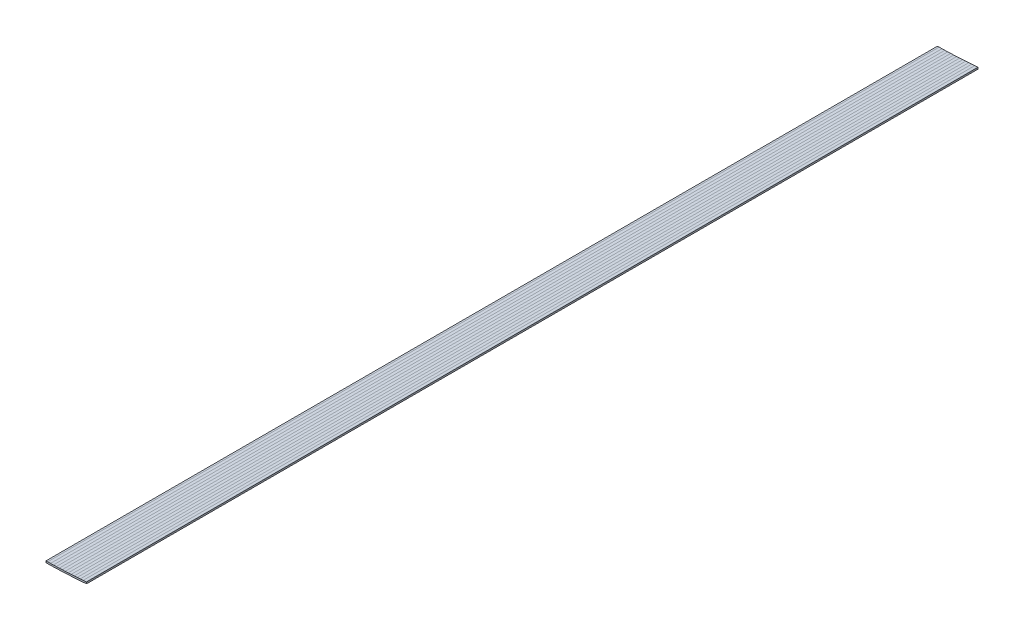
ISO-10303-21;
HEADER;
FILE_DESCRIPTION(('STEP AP214'),'2;1');
FILE_NAME('part.step','',(''),(''),'','','');
FILE_SCHEMA(('AUTOMOTIVE_DESIGN { 1 0 10303 214 1 1 1 1 }'));
ENDSEC;
DATA;
#1=APPLICATION_CONTEXT('core data for automotive mechanical design processes');
#2=APPLICATION_PROTOCOL_DEFINITION('international standard','automotive_design',2000,#1);
#3=PRODUCT_CONTEXT('',#1,'mechanical');
#4=PRODUCT('Part','Part','',(#3));
#5=PRODUCT_RELATED_PRODUCT_CATEGORY('part','',(#4));
#6=PRODUCT_DEFINITION_FORMATION('','',#4);
#7=PRODUCT_DEFINITION_CONTEXT('part definition',#1,'design');
#8=PRODUCT_DEFINITION('design','',#6,#7);
#9=PRODUCT_DEFINITION_SHAPE('','',#8);
#10=(LENGTH_UNIT() NAMED_UNIT(*) SI_UNIT(.MILLI.,.METRE.));
#11=(NAMED_UNIT(*) PLANE_ANGLE_UNIT() SI_UNIT($,.RADIAN.));
#12=(NAMED_UNIT(*) SI_UNIT($,.STERADIAN.) SOLID_ANGLE_UNIT());
#13=UNCERTAINTY_MEASURE_WITH_UNIT(LENGTH_MEASURE(1.E-05),#10,'distance_accuracy_value','');
#14=(GEOMETRIC_REPRESENTATION_CONTEXT(3) GLOBAL_UNCERTAINTY_ASSIGNED_CONTEXT((#13)) GLOBAL_UNIT_ASSIGNED_CONTEXT((#10,
#11,#12)) REPRESENTATION_CONTEXT('',''));
#15=CARTESIAN_POINT('',(0.,0.,0.));
#16=DIRECTION('',(0.,0.,1.));
#17=DIRECTION('',(1.,0.,0.));
#18=AXIS2_PLACEMENT_3D('',#15,#16,#17);
#19=CARTESIAN_POINT('',(22.,-1.5475306729059,220.));
#20=DIRECTION('',(-0.0798423068961218,0.996807507009004,0.));
#21=DIRECTION('',(-0.996807507009004,-0.0798423068961218,0.));
#22=AXIS2_PLACEMENT_3D('',#19,#20,#21);
#23=PLANE('',#22);
#24=DIRECTION('',(0.996807507009004,0.0798423068961218,0.));
#25=VECTOR('',#24,1.);
#26=CARTESIAN_POINT('',(22.,-1.5475306729059,0.));
#27=LINE('',#26,#25);
#28=CARTESIAN_POINT('',(21.9527164743502,-1.55131798965413,0.));
#29=VERTEX_POINT('',#28);
#30=CARTESIAN_POINT('',(22.,-1.5475306729059,0.));
#31=VERTEX_POINT('',#30);
#32=EDGE_CURVE('E282',#29,#31,#27,.T.);
#33=ORIENTED_EDGE('',*,*,#32,.T.);
#34=DIRECTION('',(0.,0.,-1.));
#35=VECTOR('',#34,1.);
#36=CARTESIAN_POINT('',(22.,-1.5475306729059,220.));
#37=LINE('',#36,#35);
#38=CARTESIAN_POINT('',(22.,-1.5475306729059,220.));
#39=VERTEX_POINT('',#38);
#40=EDGE_CURVE('E11',#39,#31,#37,.T.);
#41=ORIENTED_EDGE('',*,*,#40,.F.);
#42=DIRECTION('',(0.996807507009004,0.0798423068961218,0.));
#43=VECTOR('',#42,1.);
#44=CARTESIAN_POINT('',(22.,-1.5475306729059,220.));
#45=LINE('',#44,#43);
#46=CARTESIAN_POINT('',(21.9527164743502,-1.55131798965413,220.));
#47=VERTEX_POINT('',#46);
#48=EDGE_CURVE('E345',#47,#39,#45,.T.);
#49=ORIENTED_EDGE('',*,*,#48,.F.);
#50=DIRECTION('',(0.,0.,-1.));
#51=VECTOR('',#50,1.);
#52=CARTESIAN_POINT('',(21.9527164743502,-1.55131798965413,220.));
#53=LINE('',#52,#51);
#54=EDGE_CURVE('E280',#47,#29,#53,.T.);
#55=ORIENTED_EDGE('',*,*,#54,.T.);
#56=EDGE_LOOP('',(#33,#41,#49,#55));
#57=FACE_BOUND('',#56,.T.);
#58=ADVANCED_FACE('F41',(#57),#23,.F.);
#59=CARTESIAN_POINT('',(22.,-1.14624958584804,220.));
#60=DIRECTION('',(-1.,0.,0.));
#61=DIRECTION('',(0.,0.,1.));
#62=AXIS2_PLACEMENT_3D('',#59,#60,#61);
#63=PLANE('',#62);
#64=DIRECTION('',(0.,1.,0.));
#65=VECTOR('',#64,1.);
#66=CARTESIAN_POINT('',(22.,-1.14624958584804,0.));
#67=LINE('',#66,#65);
#68=CARTESIAN_POINT('',(22.,-1.14624958584804,0.));
#69=VERTEX_POINT('',#68);
#70=EDGE_CURVE('E281',#31,#69,#67,.T.);
#71=ORIENTED_EDGE('',*,*,#70,.T.);
#72=DIRECTION('',(0.,0.,-1.));
#73=VECTOR('',#72,1.);
#74=CARTESIAN_POINT('',(22.,-1.14624958584804,220.));
#75=LINE('',#74,#73);
#76=CARTESIAN_POINT('',(22.,-1.14624958584804,220.));
#77=VERTEX_POINT('',#76);
#78=EDGE_CURVE('E47',#77,#69,#75,.T.);
#79=ORIENTED_EDGE('',*,*,#78,.F.);
#80=DIRECTION('',(0.,1.,0.));
#81=VECTOR('',#80,1.);
#82=CARTESIAN_POINT('',(22.,-1.14624958584804,220.));
#83=LINE('',#82,#81);
#84=EDGE_CURVE('E175',#39,#77,#83,.T.);
#85=ORIENTED_EDGE('',*,*,#84,.F.);
#86=ORIENTED_EDGE('',*,*,#40,.T.);
#87=EDGE_LOOP('',(#71,#79,#85,#86));
#88=FACE_BOUND('',#87,.T.);
#89=ADVANCED_FACE('F522',(#88),#63,.F.);
#90=CARTESIAN_POINT('',(21.9214550960875,-1.1525408770745,220.));
#91=DIRECTION('',(0.0798423068961165,-0.996807507009004,0.));
#92=DIRECTION('',(0.996807507009005,0.0798423068961166,0.));
#93=AXIS2_PLACEMENT_3D('',#90,#91,#92);
#94=PLANE('',#93);
#95=DIRECTION('',(-0.996807507009004,-0.0798423068961165,0.));
#96=VECTOR('',#95,1.);
#97=CARTESIAN_POINT('',(21.9214550960875,-1.1525408770745,0.));
#98=LINE('',#97,#96);
#99=CARTESIAN_POINT('',(21.9214550960875,-1.1525408770745,0.));
#100=VERTEX_POINT('',#99);
#101=EDGE_CURVE('E287',#69,#100,#98,.T.);
#102=ORIENTED_EDGE('',*,*,#101,.T.);
#103=DIRECTION('',(0.,0.,-1.));
#104=VECTOR('',#103,1.);
#105=CARTESIAN_POINT('',(21.9214550960875,-1.1525408770745,220.));
#106=LINE('',#105,#104);
#107=CARTESIAN_POINT('',(21.9214550960875,-1.1525408770745,220.));
#108=VERTEX_POINT('',#107);
#109=EDGE_CURVE('E424',#108,#100,#106,.T.);
#110=ORIENTED_EDGE('',*,*,#109,.F.);
#111=DIRECTION('',(-0.996807507009004,-0.0798423068961165,0.));
#112=VECTOR('',#111,1.);
#113=CARTESIAN_POINT('',(21.9214550960875,-1.1525408770745,220.));
#114=LINE('',#113,#112);
#115=EDGE_CURVE('E428',#77,#108,#114,.T.);
#116=ORIENTED_EDGE('',*,*,#115,.F.);
#117=ORIENTED_EDGE('',*,*,#78,.T.);
#118=EDGE_LOOP('',(#102,#110,#116,#117));
#119=FACE_BOUND('',#118,.T.);
#120=ADVANCED_FACE('F426',(#119),#94,.F.);
#121=CARTESIAN_POINT('',(21.1846705359667,-1.20904389373843,220.));
#122=DIRECTION('',(0.0764641357318034,-0.997072332354473,0.));
#123=DIRECTION('',(0.997072332354473,0.0764641357318034,0.));
#124=AXIS2_PLACEMENT_3D('',#121,#122,#123);
#125=PLANE('',#124);
#126=DIRECTION('',(-0.997072332354473,-0.0764641357318034,0.));
#127=VECTOR('',#126,1.);
#128=CARTESIAN_POINT('',(21.1846705359667,-1.20904389373843,0.));
#129=LINE('',#128,#127);
#130=CARTESIAN_POINT('',(21.1846705359667,-1.20904389373843,0.));
#131=VERTEX_POINT('',#130);
#132=EDGE_CURVE('E290',#100,#131,#129,.T.);
#133=ORIENTED_EDGE('',*,*,#132,.T.);
#134=DIRECTION('',(0.,0.,-1.));
#135=VECTOR('',#134,1.);
#136=CARTESIAN_POINT('',(21.1846705359667,-1.20904389373843,220.));
#137=LINE('',#136,#135);
#138=CARTESIAN_POINT('',(21.1846705359667,-1.20904389373843,220.));
#139=VERTEX_POINT('',#138);
#140=EDGE_CURVE('E416',#139,#131,#137,.T.);
#141=ORIENTED_EDGE('',*,*,#140,.F.);
#142=DIRECTION('',(-0.997072332354473,-0.0764641357318034,0.));
#143=VECTOR('',#142,1.);
#144=CARTESIAN_POINT('',(21.1846705359667,-1.20904389373843,220.));
#145=LINE('',#144,#143);
#146=EDGE_CURVE('E448',#108,#139,#145,.T.);
#147=ORIENTED_EDGE('',*,*,#146,.F.);
#148=ORIENTED_EDGE('',*,*,#109,.T.);
#149=EDGE_LOOP('',(#133,#141,#147,#148));
#150=FACE_BOUND('',#149,.T.);
#151=ADVANCED_FACE('F440',(#150),#125,.F.);
#152=CARTESIAN_POINT('',(20.4445760837068,-1.26313271891831,220.));
#153=DIRECTION('',(0.0728892789822354,-0.997340038807953,0.));
#154=DIRECTION('',(0.997340038807954,0.0728892789822355,0.));
#155=AXIS2_PLACEMENT_3D('',#152,#153,#154);
#156=PLANE('',#155);
#157=DIRECTION('',(-0.997340038807953,-0.0728892789822354,0.));
#158=VECTOR('',#157,1.);
#159=CARTESIAN_POINT('',(20.4445760837068,-1.26313271891831,0.));
#160=LINE('',#159,#158);
#161=CARTESIAN_POINT('',(20.4445760837068,-1.26313271891831,0.));
#162=VERTEX_POINT('',#161);
#163=EDGE_CURVE('E288',#131,#162,#160,.T.);
#164=ORIENTED_EDGE('',*,*,#163,.T.);
#165=DIRECTION('',(0.,0.,-1.));
#166=VECTOR('',#165,1.);
#167=CARTESIAN_POINT('',(20.4445760837068,-1.26313271891831,220.));
#168=LINE('',#167,#166);
#169=CARTESIAN_POINT('',(20.4445760837068,-1.26313271891831,220.));
#170=VERTEX_POINT('',#169);
#171=EDGE_CURVE('E417',#170,#162,#168,.T.);
#172=ORIENTED_EDGE('',*,*,#171,.F.);
#173=DIRECTION('',(-0.997340038807953,-0.0728892789822354,0.));
#174=VECTOR('',#173,1.);
#175=CARTESIAN_POINT('',(20.4445760837068,-1.26313271891831,220.));
#176=LINE('',#175,#174);
#177=EDGE_CURVE('E442',#139,#170,#176,.T.);
#178=ORIENTED_EDGE('',*,*,#177,.F.);
#179=ORIENTED_EDGE('',*,*,#140,.T.);
#180=EDGE_LOOP('',(#164,#172,#178,#179));
#181=FACE_BOUND('',#180,.T.);
#182=ADVANCED_FACE('F441',(#181),#156,.F.);
#183=CARTESIAN_POINT('',(19.7023282030514,-1.31454505798701,220.));
#184=DIRECTION('',(0.0691001630064702,-0.997609727033813,0.));
#185=DIRECTION('',(0.997609727033813,0.0691001630064702,0.));
#186=AXIS2_PLACEMENT_3D('',#183,#184,#185);
#187=PLANE('',#186);
#188=DIRECTION('',(-0.997609727033813,-0.0691001630064702,0.));
#189=VECTOR('',#188,1.);
#190=CARTESIAN_POINT('',(19.7023282030514,-1.31454505798701,0.));
#191=LINE('',#190,#189);
#192=CARTESIAN_POINT('',(19.7023282030514,-1.31454505798701,0.));
#193=VERTEX_POINT('',#192);
#194=EDGE_CURVE('E295',#162,#193,#191,.T.);
#195=ORIENTED_EDGE('',*,*,#194,.T.);
#196=DIRECTION('',(0.,0.,-1.));
#197=VECTOR('',#196,1.);
#198=CARTESIAN_POINT('',(19.7023282030514,-1.31454505798701,220.));
#199=LINE('',#198,#197);
#200=CARTESIAN_POINT('',(19.7023282030514,-1.31454505798701,220.));
#201=VERTEX_POINT('',#200);
#202=EDGE_CURVE('E412',#201,#193,#199,.T.);
#203=ORIENTED_EDGE('',*,*,#202,.F.);
#204=DIRECTION('',(-0.997609727033813,-0.0691001630064702,0.));
#205=VECTOR('',#204,1.);
#206=CARTESIAN_POINT('',(19.7023282030514,-1.31454505798701,220.));
#207=LINE('',#206,#205);
#208=EDGE_CURVE('E450',#170,#201,#207,.T.);
#209=ORIENTED_EDGE('',*,*,#208,.F.);
#210=ORIENTED_EDGE('',*,*,#171,.T.);
#211=EDGE_LOOP('',(#195,#203,#209,#210));
#212=FACE_BOUND('',#211,.T.);
#213=ADVANCED_FACE('F534',(#212),#187,.F.);
#214=CARTESIAN_POINT('',(18.9590872342926,-1.36301694213588,220.));
#215=DIRECTION('',(0.0650786654875173,-0.997880136739059,0.));
#216=DIRECTION('',(0.99788013673906,0.0650786654875173,0.));
#217=AXIS2_PLACEMENT_3D('',#214,#215,#216);
#218=PLANE('',#217);
#219=DIRECTION('',(-0.997880136739059,-0.0650786654875173,0.));
#220=VECTOR('',#219,1.);
#221=CARTESIAN_POINT('',(18.9590872342926,-1.36301694213588,0.));
#222=LINE('',#221,#220);
#223=CARTESIAN_POINT('',(18.9590872342926,-1.36301694213588,0.));
#224=VERTEX_POINT('',#223);
#225=EDGE_CURVE('E294',#193,#224,#222,.T.);
#226=ORIENTED_EDGE('',*,*,#225,.T.);
#227=DIRECTION('',(0.,0.,-1.));
#228=VECTOR('',#227,1.);
#229=CARTESIAN_POINT('',(18.9590872342926,-1.36301694213588,220.));
#230=LINE('',#229,#228);
#231=CARTESIAN_POINT('',(18.9590872342926,-1.36301694213588,220.));
#232=VERTEX_POINT('',#231);
#233=EDGE_CURVE('E409',#232,#224,#230,.T.);
#234=ORIENTED_EDGE('',*,*,#233,.F.);
#235=DIRECTION('',(-0.997880136739059,-0.0650786654875173,0.));
#236=VECTOR('',#235,1.);
#237=CARTESIAN_POINT('',(18.9590872342926,-1.36301694213588,220.));
#238=LINE('',#237,#236);
#239=EDGE_CURVE('E449',#201,#232,#238,.T.);
#240=ORIENTED_EDGE('',*,*,#239,.F.);
#241=ORIENTED_EDGE('',*,*,#202,.T.);
#242=EDGE_LOOP('',(#226,#234,#240,#241));
#243=FACE_BOUND('',#242,.T.);
#244=ADVANCED_FACE('F540',(#243),#218,.F.);
#245=CARTESIAN_POINT('',(18.2160155788332,-1.40828406157576,220.));
#246=DIRECTION('',(0.0608061906937295,-0.998149591581,0.));
#247=DIRECTION('',(0.998149591581,0.0608061906937295,0.));
#248=AXIS2_PLACEMENT_3D('',#245,#246,#247);
#249=PLANE('',#248);
#250=DIRECTION('',(-0.998149591581,-0.0608061906937295,0.));
#251=VECTOR('',#250,1.);
#252=CARTESIAN_POINT('',(18.2160155788332,-1.40828406157576,0.));
#253=LINE('',#252,#251);
#254=CARTESIAN_POINT('',(18.2160155788332,-1.40828406157576,0.));
#255=VERTEX_POINT('',#254);
#256=EDGE_CURVE('E297',#224,#255,#253,.T.);
#257=ORIENTED_EDGE('',*,*,#256,.T.);
#258=DIRECTION('',(0.,0.,-1.));
#259=VECTOR('',#258,1.);
#260=CARTESIAN_POINT('',(18.2160155788332,-1.40828406157576,220.));
#261=LINE('',#260,#259);
#262=CARTESIAN_POINT('',(18.2160155788332,-1.40828406157576,220.));
#263=VERTEX_POINT('',#262);
#264=EDGE_CURVE('E410',#263,#255,#261,.T.);
#265=ORIENTED_EDGE('',*,*,#264,.F.);
#266=DIRECTION('',(-0.998149591581,-0.0608061906937295,0.));
#267=VECTOR('',#266,1.);
#268=CARTESIAN_POINT('',(18.2160155788332,-1.40828406157576,220.));
#269=LINE('',#268,#267);
#270=EDGE_CURVE('E456',#232,#263,#269,.T.);
#271=ORIENTED_EDGE('',*,*,#270,.F.);
#272=ORIENTED_EDGE('',*,*,#233,.T.);
#273=EDGE_LOOP('',(#257,#265,#271,#272));
#274=FACE_BOUND('',#273,.T.);
#275=ADVANCED_FACE('F541',(#274),#249,.F.);
#276=CARTESIAN_POINT('',(17.4742758909573,-1.45008331687681,220.));
#277=DIRECTION('',(0.0562637317682948,-0.998415941623282,0.));
#278=DIRECTION('',(0.998415941623282,0.0562637317682948,0.));
#279=AXIS2_PLACEMENT_3D('',#276,#277,#278);
#280=PLANE('',#279);
#281=DIRECTION('',(-0.998415941623282,-0.0562637317682948,0.));
#282=VECTOR('',#281,1.);
#283=CARTESIAN_POINT('',(17.4742758909573,-1.45008331687681,0.));
#284=LINE('',#283,#282);
#285=CARTESIAN_POINT('',(17.4742758909573,-1.45008331687681,0.));
#286=VERTEX_POINT('',#285);
#287=EDGE_CURVE('E300',#255,#286,#284,.T.);
#288=ORIENTED_EDGE('',*,*,#287,.T.);
#289=DIRECTION('',(0.,0.,-1.));
#290=VECTOR('',#289,1.);
#291=CARTESIAN_POINT('',(17.4742758909573,-1.45008331687681,220.));
#292=LINE('',#291,#290);
#293=CARTESIAN_POINT('',(17.4742758909573,-1.45008331687681,220.));
#294=VERTEX_POINT('',#293);
#295=EDGE_CURVE('E402',#294,#286,#292,.T.);
#296=ORIENTED_EDGE('',*,*,#295,.F.);
#297=DIRECTION('',(-0.998415941623282,-0.0562637317682948,0.));
#298=VECTOR('',#297,1.);
#299=CARTESIAN_POINT('',(17.4742758909573,-1.45008331687681,220.));
#300=LINE('',#299,#298);
#301=EDGE_CURVE('E457',#263,#294,#300,.T.);
#302=ORIENTED_EDGE('',*,*,#301,.F.);
#303=ORIENTED_EDGE('',*,*,#264,.T.);
#304=EDGE_LOOP('',(#288,#296,#302,#303));
#305=FACE_BOUND('',#304,.T.);
#306=ADVANCED_FACE('F544',(#305),#280,.F.);
#307=CARTESIAN_POINT('',(16.7350292827461,-1.48815457307719,220.));
#308=DIRECTION('',(0.0514319154027312,-0.998676503217136,0.));
#309=DIRECTION('',(0.998676503217136,0.0514319154027312,0.));
#310=AXIS2_PLACEMENT_3D('',#307,#308,#309);
#311=PLANE('',#310);
#312=DIRECTION('',(-0.998676503217136,-0.0514319154027312,0.));
#313=VECTOR('',#312,1.);
#314=CARTESIAN_POINT('',(16.7350292827461,-1.48815457307719,0.));
#315=LINE('',#314,#313);
#316=CARTESIAN_POINT('',(16.7350292827461,-1.48815457307719,0.));
#317=VERTEX_POINT('',#316);
#318=EDGE_CURVE('E298',#286,#317,#315,.T.);
#319=ORIENTED_EDGE('',*,*,#318,.T.);
#320=DIRECTION('',(0.,0.,-1.));
#321=VECTOR('',#320,1.);
#322=CARTESIAN_POINT('',(16.7350292827461,-1.48815457307719,220.));
#323=LINE('',#322,#321);
#324=CARTESIAN_POINT('',(16.7350292827461,-1.48815457307719,220.));
#325=VERTEX_POINT('',#324);
#326=EDGE_CURVE('E401',#325,#317,#323,.T.);
#327=ORIENTED_EDGE('',*,*,#326,.F.);
#328=DIRECTION('',(-0.998676503217136,-0.0514319154027312,0.));
#329=VECTOR('',#328,1.);
#330=CARTESIAN_POINT('',(16.7350292827461,-1.48815457307719,220.));
#331=LINE('',#330,#329);
#332=EDGE_CURVE('E459',#294,#325,#331,.T.);
#333=ORIENTED_EDGE('',*,*,#332,.F.);
#334=ORIENTED_EDGE('',*,*,#295,.T.);
#335=EDGE_LOOP('',(#319,#327,#333,#334));
#336=FACE_BOUND('',#335,.T.);
#337=ADVANCED_FACE('F548',(#336),#311,.F.);
#338=CARTESIAN_POINT('',(15.9994335484656,-1.52224259514114,220.));
#339=DIRECTION('',(0.0462910236967297,-0.99892799596623,0.));
#340=DIRECTION('',(0.99892799596623,0.0462910236967297,0.));
#341=AXIS2_PLACEMENT_3D('',#338,#339,#340);
#342=PLANE('',#341);
#343=DIRECTION('',(-0.99892799596623,-0.0462910236967297,0.));
#344=VECTOR('',#343,1.);
#345=CARTESIAN_POINT('',(15.9994335484656,-1.52224259514114,0.));
#346=LINE('',#345,#344);
#347=CARTESIAN_POINT('',(15.9994335484656,-1.52224259514114,0.));
#348=VERTEX_POINT('',#347);
#349=EDGE_CURVE('E302',#317,#348,#346,.T.);
#350=ORIENTED_EDGE('',*,*,#349,.T.);
#351=DIRECTION('',(0.,0.,-1.));
#352=VECTOR('',#351,1.);
#353=CARTESIAN_POINT('',(15.9994335484656,-1.52224259514114,220.));
#354=LINE('',#353,#352);
#355=CARTESIAN_POINT('',(15.9994335484656,-1.52224259514114,220.));
#356=VERTEX_POINT('',#355);
#357=EDGE_CURVE('E396',#356,#348,#354,.T.);
#358=ORIENTED_EDGE('',*,*,#357,.F.);
#359=DIRECTION('',(-0.99892799596623,-0.0462910236967297,0.));
#360=VECTOR('',#359,1.);
#361=CARTESIAN_POINT('',(15.9994335484656,-1.52224259514114,220.));
#362=LINE('',#361,#360);
#363=EDGE_CURVE('E465',#325,#356,#362,.T.);
#364=ORIENTED_EDGE('',*,*,#363,.F.);
#365=ORIENTED_EDGE('',*,*,#326,.T.);
#366=EDGE_LOOP('',(#350,#358,#364,#365));
#367=FACE_BOUND('',#366,.T.);
#368=ADVANCED_FACE('F554',(#367),#342,.F.);
#369=CARTESIAN_POINT('',(15.2686414152349,-1.55209913770248,220.));
#370=DIRECTION('',(0.0408209873416693,-0.999166476115192,0.));
#371=DIRECTION('',(0.999166476115192,0.0408209873416693,0.));
#372=AXIS2_PLACEMENT_3D('',#369,#370,#371);
#373=PLANE('',#372);
#374=DIRECTION('',(-0.999166476115192,-0.0408209873416693,0.));
#375=VECTOR('',#374,1.);
#376=CARTESIAN_POINT('',(15.2686414152349,-1.55209913770248,0.));
#377=LINE('',#376,#375);
#378=CARTESIAN_POINT('',(15.2686414152349,-1.55209913770248,0.));
#379=VERTEX_POINT('',#378);
#380=EDGE_CURVE('E305',#348,#379,#377,.T.);
#381=ORIENTED_EDGE('',*,*,#380,.T.);
#382=DIRECTION('',(0.,0.,-1.));
#383=VECTOR('',#382,1.);
#384=CARTESIAN_POINT('',(15.2686414152349,-1.55209913770248,220.));
#385=LINE('',#384,#383);
#386=CARTESIAN_POINT('',(15.2686414152349,-1.55209913770248,220.));
#387=VERTEX_POINT('',#386);
#388=EDGE_CURVE('E394',#387,#379,#385,.T.);
#389=ORIENTED_EDGE('',*,*,#388,.F.);
#390=DIRECTION('',(-0.999166476115192,-0.0408209873416693,0.));
#391=VECTOR('',#390,1.);
#392=CARTESIAN_POINT('',(15.2686414152349,-1.55209913770248,220.));
#393=LINE('',#392,#391);
#394=EDGE_CURVE('E461',#356,#387,#393,.T.);
#395=ORIENTED_EDGE('',*,*,#394,.F.);
#396=ORIENTED_EDGE('',*,*,#357,.T.);
#397=EDGE_LOOP('',(#381,#389,#395,#396));
#398=FACE_BOUND('',#397,.T.);
#399=ADVANCED_FACE('F559',(#398),#373,.F.);
#400=CARTESIAN_POINT('',(14.5437988273589,-1.5774851569678,220.));
#401=DIRECTION('',(0.035001343455341,-0.999387265256228,0.));
#402=DIRECTION('',(0.999387265256228,0.035001343455341,0.));
#403=AXIS2_PLACEMENT_3D('',#400,#401,#402);
#404=PLANE('',#403);
#405=DIRECTION('',(-0.999387265256228,-0.035001343455341,0.));
#406=VECTOR('',#405,1.);
#407=CARTESIAN_POINT('',(14.5437988273589,-1.5774851569678,0.));
#408=LINE('',#407,#406);
#409=CARTESIAN_POINT('',(14.5437988273589,-1.5774851569678,0.));
#410=VERTEX_POINT('',#409);
#411=EDGE_CURVE('E308',#379,#410,#408,.T.);
#412=ORIENTED_EDGE('',*,*,#411,.T.);
#413=DIRECTION('',(0.,0.,-1.));
#414=VECTOR('',#413,1.);
#415=CARTESIAN_POINT('',(14.5437988273589,-1.5774851569678,220.));
#416=LINE('',#415,#414);
#417=CARTESIAN_POINT('',(14.5437988273589,-1.5774851569678,220.));
#418=VERTEX_POINT('',#417);
#419=EDGE_CURVE('E392',#418,#410,#416,.T.);
#420=ORIENTED_EDGE('',*,*,#419,.F.);
#421=DIRECTION('',(-0.999387265256228,-0.035001343455341,0.));
#422=VECTOR('',#421,1.);
#423=CARTESIAN_POINT('',(14.5437988273589,-1.5774851569678,220.));
#424=LINE('',#423,#422);
#425=EDGE_CURVE('E467',#387,#418,#424,.T.);
#426=ORIENTED_EDGE('',*,*,#425,.F.);
#427=ORIENTED_EDGE('',*,*,#388,.T.);
#428=EDGE_LOOP('',(#412,#420,#426,#427));
#429=FACE_BOUND('',#428,.T.);
#430=ADVANCED_FACE('F562',(#429),#404,.F.);
#431=CARTESIAN_POINT('',(13.8260432724261,-1.59817310834428,220.));
#432=DIRECTION('',(0.0288111503975783,-0.999584872641022,0.));
#433=DIRECTION('',(0.999584872641022,0.0288111503975783,0.));
#434=AXIS2_PLACEMENT_3D('',#431,#432,#433);
#435=PLANE('',#434);
#436=DIRECTION('',(-0.999584872641022,-0.0288111503975783,0.));
#437=VECTOR('',#436,1.);
#438=CARTESIAN_POINT('',(13.8260432724261,-1.59817310834428,0.));
#439=LINE('',#438,#437);
#440=CARTESIAN_POINT('',(13.8260432724261,-1.59817310834428,0.));
#441=VERTEX_POINT('',#440);
#442=EDGE_CURVE('E306',#410,#441,#439,.T.);
#443=ORIENTED_EDGE('',*,*,#442,.T.);
#444=DIRECTION('',(0.,0.,-1.));
#445=VECTOR('',#444,1.);
#446=CARTESIAN_POINT('',(13.8260432724261,-1.59817310834428,220.));
#447=LINE('',#446,#445);
#448=CARTESIAN_POINT('',(13.8260432724261,-1.59817310834428,220.));
#449=VERTEX_POINT('',#448);
#450=EDGE_CURVE('E386',#449,#441,#447,.T.);
#451=ORIENTED_EDGE('',*,*,#450,.F.);
#452=DIRECTION('',(-0.999584872641022,-0.0288111503975783,0.));
#453=VECTOR('',#452,1.);
#454=CARTESIAN_POINT('',(13.8260432724261,-1.59817310834428,220.));
#455=LINE('',#454,#453);
#456=EDGE_CURVE('E470',#418,#449,#455,.T.);
#457=ORIENTED_EDGE('',*,*,#456,.F.);
#458=ORIENTED_EDGE('',*,*,#419,.T.);
#459=EDGE_LOOP('',(#443,#451,#457,#458));
#460=FACE_BOUND('',#459,.T.);
#461=ADVANCED_FACE('F563',(#460),#435,.F.);
#462=CARTESIAN_POINT('',(13.1165021581669,-1.61394928996735,220.));
#463=DIRECTION('',(0.0222288506569368,-0.999752908572149,0.));
#464=DIRECTION('',(0.999752908572149,0.0222288506569368,0.));
#465=AXIS2_PLACEMENT_3D('',#462,#463,#464);
#466=PLANE('',#465);
#467=DIRECTION('',(-0.999752908572149,-0.0222288506569368,0.));
#468=VECTOR('',#467,1.);
#469=CARTESIAN_POINT('',(13.1165021581669,-1.61394928996735,0.));
#470=LINE('',#469,#468);
#471=CARTESIAN_POINT('',(13.1165021581669,-1.61394928996735,0.));
#472=VERTEX_POINT('',#471);
#473=EDGE_CURVE('E307',#441,#472,#470,.T.);
#474=ORIENTED_EDGE('',*,*,#473,.T.);
#475=DIRECTION('',(0.,0.,-1.));
#476=VECTOR('',#475,1.);
#477=CARTESIAN_POINT('',(13.1165021581669,-1.61394928996735,220.));
#478=LINE('',#477,#476);
#479=CARTESIAN_POINT('',(13.1165021581669,-1.61394928996735,220.));
#480=VERTEX_POINT('',#479);
#481=EDGE_CURVE('E387',#480,#472,#478,.T.);
#482=ORIENTED_EDGE('',*,*,#481,.F.);
#483=DIRECTION('',(-0.999752908572149,-0.0222288506569368,0.));
#484=VECTOR('',#483,1.);
#485=CARTESIAN_POINT('',(13.1165021581669,-1.61394928996735,220.));
#486=LINE('',#485,#484);
#487=EDGE_CURVE('E468',#449,#480,#486,.T.);
#488=ORIENTED_EDGE('',*,*,#487,.F.);
#489=ORIENTED_EDGE('',*,*,#450,.T.);
#490=EDGE_LOOP('',(#474,#482,#488,#489));
#491=FACE_BOUND('',#490,.T.);
#492=ADVANCED_FACE('F566',(#491),#466,.F.);
#493=CARTESIAN_POINT('',(12.4162912501855,-1.62461618999236,220.));
#494=DIRECTION('',(0.0152320713458354,-0.999883985271549,0.));
#495=DIRECTION('',(0.999883985271549,0.0152320713458354,0.));
#496=AXIS2_PLACEMENT_3D('',#493,#494,#495);
#497=PLANE('',#496);
#498=DIRECTION('',(-0.999883985271549,-0.0152320713458354,0.));
#499=VECTOR('',#498,1.);
#500=CARTESIAN_POINT('',(12.4162912501855,-1.62461618999236,0.));
#501=LINE('',#500,#499);
#502=CARTESIAN_POINT('',(12.4162912501855,-1.62461618999236,0.));
#503=VERTEX_POINT('',#502);
#504=EDGE_CURVE('E315',#472,#503,#501,.T.);
#505=ORIENTED_EDGE('',*,*,#504,.T.);
#506=DIRECTION('',(0.,0.,-1.));
#507=VECTOR('',#506,1.);
#508=CARTESIAN_POINT('',(12.4162912501855,-1.62461618999236,220.));
#509=LINE('',#508,#507);
#510=CARTESIAN_POINT('',(12.4162912501855,-1.62461618999236,220.));
#511=VERTEX_POINT('',#510);
#512=EDGE_CURVE('E381',#511,#503,#509,.T.);
#513=ORIENTED_EDGE('',*,*,#512,.F.);
#514=DIRECTION('',(-0.999883985271549,-0.0152320713458354,0.));
#515=VECTOR('',#514,1.);
#516=CARTESIAN_POINT('',(12.4162912501855,-1.62461618999236,220.));
#517=LINE('',#516,#515);
#518=EDGE_CURVE('E475',#480,#511,#517,.T.);
#519=ORIENTED_EDGE('',*,*,#518,.F.);
#520=ORIENTED_EDGE('',*,*,#481,.T.);
#521=EDGE_LOOP('',(#505,#513,#519,#520));
#522=FACE_BOUND('',#521,.T.);
#523=ADVANCED_FACE('F571',(#522),#497,.F.);
#524=CARTESIAN_POINT('',(12.,-1.62786225720325,220.));
#525=DIRECTION('',(0.00779734988343794,-0.999969600205324,0.));
#526=DIRECTION('',(0.999969600205324,0.00779734988343794,0.));
#527=AXIS2_PLACEMENT_3D('',#524,#525,#526);
#528=PLANE('',#527);
#529=DIRECTION('',(-0.999969600205324,-0.00779734988343794,0.));
#530=VECTOR('',#529,1.);
#531=CARTESIAN_POINT('',(12.,-1.62786225720325,0.));
#532=LINE('',#531,#530);
#533=CARTESIAN_POINT('',(12.,-1.62786225720325,0.));
#534=VERTEX_POINT('',#533);
#535=EDGE_CURVE('E312',#503,#534,#532,.T.);
#536=ORIENTED_EDGE('',*,*,#535,.T.);
#537=DIRECTION('',(0.,0.,-1.));
#538=VECTOR('',#537,1.);
#539=CARTESIAN_POINT('',(12.,-1.62786225720325,220.));
#540=LINE('',#539,#538);
#541=CARTESIAN_POINT('',(12.,-1.62786225720325,220.));
#542=VERTEX_POINT('',#541);
#543=EDGE_CURVE('E378',#542,#534,#540,.T.);
#544=ORIENTED_EDGE('',*,*,#543,.F.);
#545=DIRECTION('',(-0.999969600205324,-0.00779734988343794,0.));
#546=VECTOR('',#545,1.);
#547=CARTESIAN_POINT('',(12.,-1.62786225720325,220.));
#548=LINE('',#547,#546);
#549=EDGE_CURVE('E474',#511,#542,#548,.T.);
#550=ORIENTED_EDGE('',*,*,#549,.F.);
#551=ORIENTED_EDGE('',*,*,#512,.T.);
#552=EDGE_LOOP('',(#536,#544,#550,#551));
#553=FACE_BOUND('',#552,.T.);
#554=ADVANCED_FACE('F580',(#553),#528,.F.);
#555=CARTESIAN_POINT('',(12.,-2.02787441749079,220.));
#556=DIRECTION('',(1.,0.,0.));
#557=DIRECTION('',(0.,0.,-1.));
#558=AXIS2_PLACEMENT_3D('',#555,#556,#557);
#559=PLANE('',#558);
#560=DIRECTION('',(0.,-1.,0.));
#561=VECTOR('',#560,1.);
#562=CARTESIAN_POINT('',(12.,-2.02787441749079,0.));
#563=LINE('',#562,#561);
#564=CARTESIAN_POINT('',(12.,-2.02787441749079,0.));
#565=VERTEX_POINT('',#564);
#566=EDGE_CURVE('E316',#534,#565,#563,.T.);
#567=ORIENTED_EDGE('',*,*,#566,.T.);
#568=DIRECTION('',(0.,0.,-1.));
#569=VECTOR('',#568,1.);
#570=CARTESIAN_POINT('',(12.,-2.02787441749079,220.));
#571=LINE('',#570,#569);
#572=CARTESIAN_POINT('',(12.,-2.02787441749079,220.));
#573=VERTEX_POINT('',#572);
#574=EDGE_CURVE('E379',#573,#565,#571,.T.);
#575=ORIENTED_EDGE('',*,*,#574,.F.);
#576=DIRECTION('',(0.,-1.,0.));
#577=VECTOR('',#576,1.);
#578=CARTESIAN_POINT('',(12.,-2.02787441749079,220.));
#579=LINE('',#578,#577);
#580=EDGE_CURVE('E477',#542,#573,#579,.T.);
#581=ORIENTED_EDGE('',*,*,#580,.F.);
#582=ORIENTED_EDGE('',*,*,#543,.T.);
#583=EDGE_LOOP('',(#567,#575,#581,#582));
#584=FACE_BOUND('',#583,.T.);
#585=ADVANCED_FACE('F581',(#584),#559,.F.);
#586=CARTESIAN_POINT('',(12.4208971980884,-2.02459243500074,220.));
#587=DIRECTION('',(-0.00779734988343685,0.999969600205324,0.));
#588=DIRECTION('',(-0.999969600205324,-0.00779734988343685,0.));
#589=AXIS2_PLACEMENT_3D('',#586,#587,#588);
#590=PLANE('',#589);
#591=DIRECTION('',(0.999969600205324,0.00779734988343685,0.));
#592=VECTOR('',#591,1.);
#593=CARTESIAN_POINT('',(12.4208971980884,-2.02459243500074,0.));
#594=LINE('',#593,#592);
#595=CARTESIAN_POINT('',(12.4208971980884,-2.02459243500074,0.));
#596=VERTEX_POINT('',#595);
#597=EDGE_CURVE('E318',#565,#596,#594,.T.);
#598=ORIENTED_EDGE('',*,*,#597,.T.);
#599=DIRECTION('',(0.,0.,-1.));
#600=VECTOR('',#599,1.);
#601=CARTESIAN_POINT('',(12.4208971980884,-2.02459243500074,220.));
#602=LINE('',#601,#600);
#603=CARTESIAN_POINT('',(12.4208971980884,-2.02459243500074,220.));
#604=VERTEX_POINT('',#603);
#605=EDGE_CURVE('E371',#604,#596,#602,.T.);
#606=ORIENTED_EDGE('',*,*,#605,.F.);
#607=DIRECTION('',(0.999969600205324,0.00779734988343685,0.));
#608=VECTOR('',#607,1.);
#609=CARTESIAN_POINT('',(12.4208971980884,-2.02459243500074,220.));
#610=LINE('',#609,#608);
#611=EDGE_CURVE('E480',#573,#604,#610,.T.);
#612=ORIENTED_EDGE('',*,*,#611,.F.);
#613=ORIENTED_EDGE('',*,*,#574,.T.);
#614=EDGE_LOOP('',(#598,#606,#612,#613));
#615=FACE_BOUND('',#614,.T.);
#616=ADVANCED_FACE('F584',(#615),#590,.F.);
#617=CARTESIAN_POINT('',(13.1239944342956,-2.01388156511711,220.));
#618=DIRECTION('',(-0.0152320713458356,0.999883985271549,0.));
#619=DIRECTION('',(-0.999883985271549,-0.0152320713458356,0.));
#620=AXIS2_PLACEMENT_3D('',#617,#618,#619);
#621=PLANE('',#620);
#622=DIRECTION('',(0.999883985271549,0.0152320713458356,0.));
#623=VECTOR('',#622,1.);
#624=CARTESIAN_POINT('',(13.1239944342956,-2.01388156511711,0.));
#625=LINE('',#624,#623);
#626=CARTESIAN_POINT('',(13.1239944342956,-2.01388156511711,0.));
#627=VERTEX_POINT('',#626);
#628=EDGE_CURVE('E319',#596,#627,#625,.T.);
#629=ORIENTED_EDGE('',*,*,#628,.T.);
#630=DIRECTION('',(0.,0.,-1.));
#631=VECTOR('',#630,1.);
#632=CARTESIAN_POINT('',(13.1239944342956,-2.01388156511711,220.));
#633=LINE('',#632,#631);
#634=CARTESIAN_POINT('',(13.1239944342956,-2.01388156511711,220.));
#635=VERTEX_POINT('',#634);
#636=EDGE_CURVE('E372',#635,#627,#633,.T.);
#637=ORIENTED_EDGE('',*,*,#636,.F.);
#638=DIRECTION('',(0.999883985271549,0.0152320713458356,0.));
#639=VECTOR('',#638,1.);
#640=CARTESIAN_POINT('',(13.1239944342956,-2.01388156511711,220.));
#641=LINE('',#640,#639);
#642=EDGE_CURVE('E478',#604,#635,#641,.T.);
#643=ORIENTED_EDGE('',*,*,#642,.F.);
#644=ORIENTED_EDGE('',*,*,#605,.T.);
#645=EDGE_LOOP('',(#629,#637,#643,#644));
#646=FACE_BOUND('',#645,.T.);
#647=ADVANCED_FACE('F587',(#646),#621,.F.);
#648=CARTESIAN_POINT('',(13.8362513832799,-1.99804499868896,220.));
#649=DIRECTION('',(-0.0222288506569369,0.999752908572149,0.));
#650=DIRECTION('',(-0.999752908572149,-0.0222288506569369,0.));
#651=AXIS2_PLACEMENT_3D('',#648,#649,#650);
#652=PLANE('',#651);
#653=DIRECTION('',(0.999752908572149,0.0222288506569369,0.));
#654=VECTOR('',#653,1.);
#655=CARTESIAN_POINT('',(13.8362513832799,-1.99804499868896,0.));
#656=LINE('',#655,#654);
#657=CARTESIAN_POINT('',(13.8362513832799,-1.99804499868896,0.));
#658=VERTEX_POINT('',#657);
#659=EDGE_CURVE('E325',#627,#658,#656,.T.);
#660=ORIENTED_EDGE('',*,*,#659,.T.);
#661=DIRECTION('',(0.,0.,-1.));
#662=VECTOR('',#661,1.);
#663=CARTESIAN_POINT('',(13.8362513832799,-1.99804499868896,220.));
#664=LINE('',#663,#662);
#665=CARTESIAN_POINT('',(13.8362513832799,-1.99804499868896,220.));
#666=VERTEX_POINT('',#665);
#667=EDGE_CURVE('E367',#666,#658,#664,.T.);
#668=ORIENTED_EDGE('',*,*,#667,.F.);
#669=DIRECTION('',(0.999752908572149,0.0222288506569369,0.));
#670=VECTOR('',#669,1.);
#671=CARTESIAN_POINT('',(13.8362513832799,-1.99804499868896,220.));
#672=LINE('',#671,#670);
#673=EDGE_CURVE('E482',#635,#666,#672,.T.);
#674=ORIENTED_EDGE('',*,*,#673,.F.);
#675=ORIENTED_EDGE('',*,*,#636,.T.);
#676=EDGE_LOOP('',(#660,#668,#674,#675));
#677=FACE_BOUND('',#676,.T.);
#678=ADVANCED_FACE('F592',(#677),#652,.F.);
#679=CARTESIAN_POINT('',(14.5565614485151,-1.97728341836657,220.));
#680=DIRECTION('',(-0.0288111503975779,0.999584872641022,0.));
#681=DIRECTION('',(-0.999584872641022,-0.0288111503975779,0.));
#682=AXIS2_PLACEMENT_3D('',#679,#680,#681);
#683=PLANE('',#682);
#684=DIRECTION('',(0.999584872641022,0.0288111503975779,0.));
#685=VECTOR('',#684,1.);
#686=CARTESIAN_POINT('',(14.5565614485151,-1.97728341836657,0.));
#687=LINE('',#686,#685);
#688=CARTESIAN_POINT('',(14.5565614485151,-1.97728341836657,0.));
#689=VERTEX_POINT('',#688);
#690=EDGE_CURVE('E323',#658,#689,#687,.T.);
#691=ORIENTED_EDGE('',*,*,#690,.T.);
#692=DIRECTION('',(0.,0.,-1.));
#693=VECTOR('',#692,1.);
#694=CARTESIAN_POINT('',(14.5565614485151,-1.97728341836657,220.));
#695=LINE('',#694,#693);
#696=CARTESIAN_POINT('',(14.5565614485151,-1.97728341836657,220.));
#697=VERTEX_POINT('',#696);
#698=EDGE_CURVE('E364',#697,#689,#695,.T.);
#699=ORIENTED_EDGE('',*,*,#698,.F.);
#700=DIRECTION('',(0.999584872641022,0.0288111503975779,0.));
#701=VECTOR('',#700,1.);
#702=CARTESIAN_POINT('',(14.5565614485151,-1.97728341836657,220.));
#703=LINE('',#702,#701);
#704=EDGE_CURVE('E485',#666,#697,#703,.T.);
#705=ORIENTED_EDGE('',*,*,#704,.F.);
#706=ORIENTED_EDGE('',*,*,#667,.T.);
#707=EDGE_LOOP('',(#691,#699,#705,#706));
#708=FACE_BOUND('',#707,.T.);
#709=ADVANCED_FACE('F600',(#708),#683,.F.);
#710=CARTESIAN_POINT('',(15.2838060099787,-1.95181327525315,220.));
#711=DIRECTION('',(-0.035001343455341,0.999387265256228,0.));
#712=DIRECTION('',(-0.999387265256228,-0.035001343455341,0.));
#713=AXIS2_PLACEMENT_3D('',#710,#711,#712);
#714=PLANE('',#713);
#715=DIRECTION('',(0.999387265256228,0.035001343455341,0.));
#716=VECTOR('',#715,1.);
#717=CARTESIAN_POINT('',(15.2838060099787,-1.95181327525315,0.));
#718=LINE('',#717,#716);
#719=CARTESIAN_POINT('',(15.2838060099787,-1.95181327525315,0.));
#720=VERTEX_POINT('',#719);
#721=EDGE_CURVE('E327',#689,#720,#718,.T.);
#722=ORIENTED_EDGE('',*,*,#721,.T.);
#723=DIRECTION('',(0.,0.,-1.));
#724=VECTOR('',#723,1.);
#725=CARTESIAN_POINT('',(15.2838060099787,-1.95181327525315,220.));
#726=LINE('',#725,#724);
#727=CARTESIAN_POINT('',(15.2838060099787,-1.95181327525315,220.));
#728=VERTEX_POINT('',#727);
#729=EDGE_CURVE('E365',#728,#720,#726,.T.);
#730=ORIENTED_EDGE('',*,*,#729,.F.);
#731=DIRECTION('',(0.999387265256228,0.035001343455341,0.));
#732=VECTOR('',#731,1.);
#733=CARTESIAN_POINT('',(15.2838060099787,-1.95181327525315,220.));
#734=LINE('',#733,#732);
#735=EDGE_CURVE('E488',#697,#728,#734,.T.);
#736=ORIENTED_EDGE('',*,*,#735,.F.);
#737=ORIENTED_EDGE('',*,*,#698,.T.);
#738=EDGE_LOOP('',(#722,#730,#736,#737));
#739=FACE_BOUND('',#738,.T.);
#740=ADVANCED_FACE('F602',(#739),#714,.F.);
#741=CARTESIAN_POINT('',(16.0168560812471,-1.92186448454071,220.));
#742=DIRECTION('',(-0.0408209873416697,0.999166476115192,0.));
#743=DIRECTION('',(-0.999166476115192,-0.0408209873416697,0.));
#744=AXIS2_PLACEMENT_3D('',#741,#742,#743);
#745=PLANE('',#744);
#746=DIRECTION('',(0.999166476115192,0.0408209873416697,0.));
#747=VECTOR('',#746,1.);
#748=CARTESIAN_POINT('',(16.0168560812471,-1.92186448454071,0.));
#749=LINE('',#748,#747);
#750=CARTESIAN_POINT('',(16.0168560812471,-1.92186448454071,0.));
#751=VERTEX_POINT('',#750);
#752=EDGE_CURVE('E329',#720,#751,#749,.T.);
#753=ORIENTED_EDGE('',*,*,#752,.T.);
#754=DIRECTION('',(0.,0.,-1.));
#755=VECTOR('',#754,1.);
#756=CARTESIAN_POINT('',(16.0168560812471,-1.92186448454071,220.));
#757=LINE('',#756,#755);
#758=CARTESIAN_POINT('',(16.0168560812471,-1.92186448454071,220.));
#759=VERTEX_POINT('',#758);
#760=EDGE_CURVE('E357',#759,#751,#757,.T.);
#761=ORIENTED_EDGE('',*,*,#760,.F.);
#762=DIRECTION('',(0.999166476115192,0.0408209873416697,0.));
#763=VECTOR('',#762,1.);
#764=CARTESIAN_POINT('',(16.0168560812471,-1.92186448454071,220.));
#765=LINE('',#764,#763);
#766=EDGE_CURVE('E486',#728,#759,#765,.T.);
#767=ORIENTED_EDGE('',*,*,#766,.F.);
#768=ORIENTED_EDGE('',*,*,#729,.T.);
#769=EDGE_LOOP('',(#753,#761,#767,#768));
#770=FACE_BOUND('',#769,.T.);
#771=ADVANCED_FACE('F603',(#770),#745,.F.);
#772=CARTESIAN_POINT('',(16.7545740000107,-1.88767811895992,220.));
#773=DIRECTION('',(-0.0462910236967294,0.99892799596623,0.));
#774=DIRECTION('',(-0.99892799596623,-0.0462910236967294,0.));
#775=AXIS2_PLACEMENT_3D('',#772,#773,#774);
#776=PLANE('',#775);
#777=DIRECTION('',(0.99892799596623,0.0462910236967294,0.));
#778=VECTOR('',#777,1.);
#779=CARTESIAN_POINT('',(16.7545740000107,-1.88767811895992,0.));
#780=LINE('',#779,#778);
#781=CARTESIAN_POINT('',(16.7545740000107,-1.88767811895992,0.));
#782=VERTEX_POINT('',#781);
#783=EDGE_CURVE('E328',#751,#782,#780,.T.);
#784=ORIENTED_EDGE('',*,*,#783,.T.);
#785=DIRECTION('',(0.,0.,-1.));
#786=VECTOR('',#785,1.);
#787=CARTESIAN_POINT('',(16.7545740000107,-1.88767811895992,220.));
#788=LINE('',#787,#786);
#789=CARTESIAN_POINT('',(16.7545740000107,-1.88767811895992,220.));
#790=VERTEX_POINT('',#789);
#791=EDGE_CURVE('E356',#790,#782,#788,.T.);
#792=ORIENTED_EDGE('',*,*,#791,.F.);
#793=DIRECTION('',(0.99892799596623,0.0462910236967294,0.));
#794=VECTOR('',#793,1.);
#795=CARTESIAN_POINT('',(16.7545740000107,-1.88767811895992,220.));
#796=LINE('',#795,#794);
#797=EDGE_CURVE('E487',#759,#790,#796,.T.);
#798=ORIENTED_EDGE('',*,*,#797,.F.);
#799=ORIENTED_EDGE('',*,*,#760,.T.);
#800=EDGE_LOOP('',(#784,#792,#798,#799));
#801=FACE_BOUND('',#800,.T.);
#802=ADVANCED_FACE('F609',(#801),#776,.F.);
#803=CARTESIAN_POINT('',(17.4958151464734,-1.84950414388883,220.));
#804=DIRECTION('',(-0.0514319154027315,0.998676503217136,0.));
#805=DIRECTION('',(-0.998676503217136,-0.0514319154027315,0.));
#806=AXIS2_PLACEMENT_3D('',#803,#804,#805);
#807=PLANE('',#806);
#808=DIRECTION('',(0.998676503217136,0.0514319154027315,0.));
#809=VECTOR('',#808,1.);
#810=CARTESIAN_POINT('',(17.4958151464734,-1.84950414388883,0.));
#811=LINE('',#810,#809);
#812=CARTESIAN_POINT('',(17.4958151464734,-1.84950414388883,0.));
#813=VERTEX_POINT('',#812);
#814=EDGE_CURVE('E334',#782,#813,#811,.T.);
#815=ORIENTED_EDGE('',*,*,#814,.T.);
#816=DIRECTION('',(0.,0.,-1.));
#817=VECTOR('',#816,1.);
#818=CARTESIAN_POINT('',(17.4958151464734,-1.84950414388883,220.));
#819=LINE('',#818,#817);
#820=CARTESIAN_POINT('',(17.4958151464734,-1.84950414388883,220.));
#821=VERTEX_POINT('',#820);
#822=EDGE_CURVE('E351',#821,#813,#819,.T.);
#823=ORIENTED_EDGE('',*,*,#822,.F.);
#824=DIRECTION('',(0.998676503217136,0.0514319154027315,0.));
#825=VECTOR('',#824,1.);
#826=CARTESIAN_POINT('',(17.4958151464734,-1.84950414388883,220.));
#827=LINE('',#826,#825);
#828=EDGE_CURVE('E495',#790,#821,#827,.T.);
#829=ORIENTED_EDGE('',*,*,#828,.F.);
#830=ORIENTED_EDGE('',*,*,#791,.T.);
#831=EDGE_LOOP('',(#815,#823,#829,#830));
#832=FACE_BOUND('',#831,.T.);
#833=ADVANCED_FACE('F615',(#832),#807,.F.);
#834=CARTESIAN_POINT('',(18.2394296845221,-1.80759923515935,220.));
#835=DIRECTION('',(-0.0562637317682948,0.998415941623282,0.));
#836=DIRECTION('',(-0.998415941623282,-0.0562637317682948,0.));
#837=AXIS2_PLACEMENT_3D('',#834,#835,#836);
#838=PLANE('',#837);
#839=DIRECTION('',(0.998415941623282,0.0562637317682948,0.));
#840=VECTOR('',#839,1.);
#841=CARTESIAN_POINT('',(18.2394296845221,-1.80759923515935,0.));
#842=LINE('',#841,#840);
#843=CARTESIAN_POINT('',(18.2394296845221,-1.80759923515935,0.));
#844=VERTEX_POINT('',#843);
#845=EDGE_CURVE('E331',#813,#844,#842,.T.);
#846=ORIENTED_EDGE('',*,*,#845,.T.);
#847=DIRECTION('',(0.,0.,-1.));
#848=VECTOR('',#847,1.);
#849=CARTESIAN_POINT('',(18.2394296845221,-1.80759923515935,220.));
#850=LINE('',#849,#848);
#851=CARTESIAN_POINT('',(18.2394296845221,-1.80759923515935,220.));
#852=VERTEX_POINT('',#851);
#853=EDGE_CURVE('E349',#852,#844,#850,.T.);
#854=ORIENTED_EDGE('',*,*,#853,.F.);
#855=DIRECTION('',(0.998415941623282,0.0562637317682948,0.));
#856=VECTOR('',#855,1.);
#857=CARTESIAN_POINT('',(18.2394296845221,-1.80759923515935,220.));
#858=LINE('',#857,#856);
#859=EDGE_CURVE('E492',#821,#852,#858,.T.);
#860=ORIENTED_EDGE('',*,*,#859,.F.);
#861=ORIENTED_EDGE('',*,*,#822,.T.);
#862=EDGE_LOOP('',(#846,#854,#860,#861));
#863=FACE_BOUND('',#862,.T.);
#864=ADVANCED_FACE('F617',(#863),#838,.F.);
#865=CARTESIAN_POINT('',(18.9842643208818,-1.76222471683486,220.));
#866=DIRECTION('',(-0.0608061906937291,0.998149591581,0.));
#867=DIRECTION('',(-0.998149591581,-0.0608061906937291,0.));
#868=AXIS2_PLACEMENT_3D('',#865,#866,#867);
#869=PLANE('',#868);
#870=DIRECTION('',(0.998149591581,0.0608061906937291,0.));
#871=VECTOR('',#870,1.);
#872=CARTESIAN_POINT('',(18.9842643208818,-1.76222471683486,0.));
#873=LINE('',#872,#871);
#874=CARTESIAN_POINT('',(18.9842643208818,-1.76222471683486,0.));
#875=VERTEX_POINT('',#874);
#876=EDGE_CURVE('E337',#844,#875,#873,.T.);
#877=ORIENTED_EDGE('',*,*,#876,.T.);
#878=DIRECTION('',(0.,0.,-1.));
#879=VECTOR('',#878,1.);
#880=CARTESIAN_POINT('',(18.9842643208818,-1.76222471683486,220.));
#881=LINE('',#880,#879);
#882=CARTESIAN_POINT('',(18.9842643208818,-1.76222471683486,220.));
#883=VERTEX_POINT('',#882);
#884=EDGE_CURVE('E347',#883,#875,#881,.T.);
#885=ORIENTED_EDGE('',*,*,#884,.F.);
#886=DIRECTION('',(0.998149591581,0.0608061906937291,0.));
#887=VECTOR('',#886,1.);
#888=CARTESIAN_POINT('',(18.9842643208818,-1.76222471683486,220.));
#889=LINE('',#888,#887);
#890=EDGE_CURVE('E496',#852,#883,#889,.T.);
#891=ORIENTED_EDGE('',*,*,#890,.F.);
#892=ORIENTED_EDGE('',*,*,#853,.T.);
#893=EDGE_LOOP('',(#877,#885,#891,#892));
#894=FACE_BOUND('',#893,.T.);
#895=ADVANCED_FACE('F505',(#894),#869,.F.);
#896=CARTESIAN_POINT('',(19.7291640777412,-1.71364465164105,220.));
#897=DIRECTION('',(-0.0650786654875169,0.997880136739059,0.));
#898=DIRECTION('',(-0.99788013673906,-0.065078665487517,0.));
#899=AXIS2_PLACEMENT_3D('',#896,#897,#898);
#900=PLANE('',#899);
#901=DIRECTION('',(0.99788013673906,0.065078665487517,0.));
#902=VECTOR('',#901,1.);
#903=CARTESIAN_POINT('',(19.7291640777412,-1.71364465164105,0.));
#904=LINE('',#903,#902);
#905=CARTESIAN_POINT('',(19.7291640777412,-1.71364465164105,0.));
#906=VERTEX_POINT('',#905);
#907=EDGE_CURVE('E336',#875,#906,#904,.T.);
#908=ORIENTED_EDGE('',*,*,#907,.T.);
#909=DIRECTION('',(0.,0.,-1.));
#910=VECTOR('',#909,1.);
#911=CARTESIAN_POINT('',(19.7291640777412,-1.71364465164105,220.));
#912=LINE('',#911,#910);
#913=CARTESIAN_POINT('',(19.7291640777412,-1.71364465164105,220.));
#914=VERTEX_POINT('',#913);
#915=EDGE_CURVE('E275',#914,#906,#912,.T.);
#916=ORIENTED_EDGE('',*,*,#915,.F.);
#917=DIRECTION('',(0.99788013673906,0.065078665487517,0.));
#918=VECTOR('',#917,1.);
#919=CARTESIAN_POINT('',(19.7291640777412,-1.71364465164105,220.));
#920=LINE('',#919,#918);
#921=EDGE_CURVE('E261',#883,#914,#920,.T.);
#922=ORIENTED_EDGE('',*,*,#921,.F.);
#923=ORIENTED_EDGE('',*,*,#884,.T.);
#924=EDGE_LOOP('',(#908,#916,#922,#923));
#925=FACE_BOUND('',#924,.T.);
#926=ADVANCED_FACE('F507',(#925),#900,.F.);
#927=CARTESIAN_POINT('',(20.4729740745513,-1.66212411146124,220.));
#928=DIRECTION('',(-0.0691001630064706,0.997609727033813,0.));
#929=DIRECTION('',(-0.997609727033813,-0.0691001630064706,0.));
#930=AXIS2_PLACEMENT_3D('',#927,#928,#929);
#931=PLANE('',#930);
#932=DIRECTION('',(0.997609727033813,0.0691001630064706,0.));
#933=VECTOR('',#932,1.);
#934=CARTESIAN_POINT('',(20.4729740745513,-1.66212411146124,0.));
#935=LINE('',#934,#933);
#936=CARTESIAN_POINT('',(20.4729740745513,-1.66212411146124,0.));
#937=VERTEX_POINT('',#936);
#938=EDGE_CURVE('E271',#906,#937,#935,.T.);
#939=ORIENTED_EDGE('',*,*,#938,.T.);
#940=DIRECTION('',(0.,0.,-1.));
#941=VECTOR('',#940,1.);
#942=CARTESIAN_POINT('',(20.4729740745513,-1.66212411146124,220.));
#943=LINE('',#942,#941);
#944=CARTESIAN_POINT('',(20.4729740745513,-1.66212411146124,220.));
#945=VERTEX_POINT('',#944);
#946=EDGE_CURVE('E268',#945,#937,#943,.T.);
#947=ORIENTED_EDGE('',*,*,#946,.F.);
#948=DIRECTION('',(0.997609727033813,0.0691001630064706,0.));
#949=VECTOR('',#948,1.);
#950=CARTESIAN_POINT('',(20.4729740745513,-1.66212411146124,220.));
#951=LINE('',#950,#949);
#952=EDGE_CURVE('E257',#914,#945,#951,.T.);
#953=ORIENTED_EDGE('',*,*,#952,.F.);
#954=ORIENTED_EDGE('',*,*,#915,.T.);
#955=EDGE_LOOP('',(#939,#947,#953,#954));
#956=FACE_BOUND('',#955,.T.);
#957=ADVANCED_FACE('F267',(#956),#931,.F.);
#958=CARTESIAN_POINT('',(21.2145413148788,-1.60792764951138,220.));
#959=DIRECTION('',(-0.0728892789822352,0.997340038807953,0.));
#960=DIRECTION('',(-0.997340038807953,-0.0728892789822352,0.));
#961=AXIS2_PLACEMENT_3D('',#958,#959,#960);
#962=PLANE('',#961);
#963=DIRECTION('',(0.997340038807953,0.0728892789822352,0.));
#964=VECTOR('',#963,1.);
#965=CARTESIAN_POINT('',(21.2145413148788,-1.60792764951138,0.));
#966=LINE('',#965,#964);
#967=CARTESIAN_POINT('',(21.2145413148788,-1.60792764951138,0.));
#968=VERTEX_POINT('',#967);
#969=EDGE_CURVE('E156',#937,#968,#966,.T.);
#970=ORIENTED_EDGE('',*,*,#969,.T.);
#971=DIRECTION('',(0.,0.,-1.));
#972=VECTOR('',#971,1.);
#973=CARTESIAN_POINT('',(21.2145413148788,-1.60792764951138,220.));
#974=LINE('',#973,#972);
#975=CARTESIAN_POINT('',(21.2145413148788,-1.60792764951138,220.));
#976=VERTEX_POINT('',#975);
#977=EDGE_CURVE('E273',#976,#968,#974,.T.);
#978=ORIENTED_EDGE('',*,*,#977,.F.);
#979=DIRECTION('',(0.997340038807953,0.0728892789822352,0.));
#980=VECTOR('',#979,1.);
#981=CARTESIAN_POINT('',(21.2145413148788,-1.60792764951138,220.));
#982=LINE('',#981,#980);
#983=EDGE_CURVE('E263',#945,#976,#982,.T.);
#984=ORIENTED_EDGE('',*,*,#983,.F.);
#985=ORIENTED_EDGE('',*,*,#946,.T.);
#986=EDGE_LOOP('',(#970,#978,#984,#985));
#987=FACE_BOUND('',#986,.T.);
#988=ADVANCED_FACE('F274',(#987),#962,.F.);
#989=CARTESIAN_POINT('',(21.9527164743502,-1.55131798965413,220.));
#990=DIRECTION('',(-0.076464135731803,0.997072332354473,0.));
#991=DIRECTION('',(-0.997072332354473,-0.076464135731803,0.));
#992=AXIS2_PLACEMENT_3D('',#989,#990,#991);
#993=PLANE('',#992);
#994=DIRECTION('',(0.997072332354473,0.076464135731803,0.));
#995=VECTOR('',#994,1.);
#996=CARTESIAN_POINT('',(21.9527164743502,-1.55131798965413,0.));
#997=LINE('',#996,#995);
#998=EDGE_CURVE('E161',#968,#29,#997,.T.);
#999=ORIENTED_EDGE('',*,*,#998,.T.);
#1000=ORIENTED_EDGE('',*,*,#54,.F.);
#1001=DIRECTION('',(0.997072332354473,0.076464135731803,0.));
#1002=VECTOR('',#1001,1.);
#1003=CARTESIAN_POINT('',(21.9527164743502,-1.55131798965413,220.));
#1004=LINE('',#1003,#1002);
#1005=EDGE_CURVE('E60',#976,#47,#1004,.T.);
#1006=ORIENTED_EDGE('',*,*,#1005,.F.);
#1007=ORIENTED_EDGE('',*,*,#977,.T.);
#1008=EDGE_LOOP('',(#999,#1000,#1006,#1007));
#1009=FACE_BOUND('',#1008,.T.);
#1010=ADVANCED_FACE('F508',(#1009),#993,.F.);
#1011=CARTESIAN_POINT('',(0.,0.,220.));
#1012=DIRECTION('',(0.,0.,-1.));
#1013=DIRECTION('',(-1.,0.,0.));
#1014=AXIS2_PLACEMENT_3D('',#1011,#1012,#1013);
#1015=PLANE('',#1014);
#1016=ORIENTED_EDGE('',*,*,#48,.T.);
#1017=ORIENTED_EDGE('',*,*,#84,.T.);
#1018=ORIENTED_EDGE('',*,*,#115,.T.);
#1019=ORIENTED_EDGE('',*,*,#146,.T.);
#1020=ORIENTED_EDGE('',*,*,#177,.T.);
#1021=ORIENTED_EDGE('',*,*,#208,.T.);
#1022=ORIENTED_EDGE('',*,*,#239,.T.);
#1023=ORIENTED_EDGE('',*,*,#270,.T.);
#1024=ORIENTED_EDGE('',*,*,#301,.T.);
#1025=ORIENTED_EDGE('',*,*,#332,.T.);
#1026=ORIENTED_EDGE('',*,*,#363,.T.);
#1027=ORIENTED_EDGE('',*,*,#394,.T.);
#1028=ORIENTED_EDGE('',*,*,#425,.T.);
#1029=ORIENTED_EDGE('',*,*,#456,.T.);
#1030=ORIENTED_EDGE('',*,*,#487,.T.);
#1031=ORIENTED_EDGE('',*,*,#518,.T.);
#1032=ORIENTED_EDGE('',*,*,#549,.T.);
#1033=ORIENTED_EDGE('',*,*,#580,.T.);
#1034=ORIENTED_EDGE('',*,*,#611,.T.);
#1035=ORIENTED_EDGE('',*,*,#642,.T.);
#1036=ORIENTED_EDGE('',*,*,#673,.T.);
#1037=ORIENTED_EDGE('',*,*,#704,.T.);
#1038=ORIENTED_EDGE('',*,*,#735,.T.);
#1039=ORIENTED_EDGE('',*,*,#766,.T.);
#1040=ORIENTED_EDGE('',*,*,#797,.T.);
#1041=ORIENTED_EDGE('',*,*,#828,.T.);
#1042=ORIENTED_EDGE('',*,*,#859,.T.);
#1043=ORIENTED_EDGE('',*,*,#890,.T.);
#1044=ORIENTED_EDGE('',*,*,#921,.T.);
#1045=ORIENTED_EDGE('',*,*,#952,.T.);
#1046=ORIENTED_EDGE('',*,*,#983,.T.);
#1047=ORIENTED_EDGE('',*,*,#1005,.T.);
#1048=EDGE_LOOP('',(#1016,#1017,#1018,#1019,#1020,#1021,#1022,#1023,#1024,#1025,#1026,#1027,
#1028,#1029,#1030,#1031,#1032,#1033,#1034,#1035,#1036,#1037,#1038,#1039,#1040,#1041,#1042,#1043,
#1044,#1045,#1046,#1047));
#1049=FACE_BOUND('',#1048,.T.);
#1050=ADVANCED_FACE('F260',(#1049),#1015,.F.);
#1051=CARTESIAN_POINT('',(0.,0.,0.));
#1052=DIRECTION('',(0.,0.,-1.));
#1053=DIRECTION('',(-1.,0.,0.));
#1054=AXIS2_PLACEMENT_3D('',#1051,#1052,#1053);
#1055=PLANE('',#1054);
#1056=ORIENTED_EDGE('',*,*,#32,.F.);
#1057=ORIENTED_EDGE('',*,*,#998,.F.);
#1058=ORIENTED_EDGE('',*,*,#969,.F.);
#1059=ORIENTED_EDGE('',*,*,#938,.F.);
#1060=ORIENTED_EDGE('',*,*,#907,.F.);
#1061=ORIENTED_EDGE('',*,*,#876,.F.);
#1062=ORIENTED_EDGE('',*,*,#845,.F.);
#1063=ORIENTED_EDGE('',*,*,#814,.F.);
#1064=ORIENTED_EDGE('',*,*,#783,.F.);
#1065=ORIENTED_EDGE('',*,*,#752,.F.);
#1066=ORIENTED_EDGE('',*,*,#721,.F.);
#1067=ORIENTED_EDGE('',*,*,#690,.F.);
#1068=ORIENTED_EDGE('',*,*,#659,.F.);
#1069=ORIENTED_EDGE('',*,*,#628,.F.);
#1070=ORIENTED_EDGE('',*,*,#597,.F.);
#1071=ORIENTED_EDGE('',*,*,#566,.F.);
#1072=ORIENTED_EDGE('',*,*,#535,.F.);
#1073=ORIENTED_EDGE('',*,*,#504,.F.);
#1074=ORIENTED_EDGE('',*,*,#473,.F.);
#1075=ORIENTED_EDGE('',*,*,#442,.F.);
#1076=ORIENTED_EDGE('',*,*,#411,.F.);
#1077=ORIENTED_EDGE('',*,*,#380,.F.);
#1078=ORIENTED_EDGE('',*,*,#349,.F.);
#1079=ORIENTED_EDGE('',*,*,#318,.F.);
#1080=ORIENTED_EDGE('',*,*,#287,.F.);
#1081=ORIENTED_EDGE('',*,*,#256,.F.);
#1082=ORIENTED_EDGE('',*,*,#225,.F.);
#1083=ORIENTED_EDGE('',*,*,#194,.F.);
#1084=ORIENTED_EDGE('',*,*,#163,.F.);
#1085=ORIENTED_EDGE('',*,*,#132,.F.);
#1086=ORIENTED_EDGE('',*,*,#101,.F.);
#1087=ORIENTED_EDGE('',*,*,#70,.F.);
#1088=EDGE_LOOP('',(#1056,#1057,#1058,#1059,#1060,#1061,#1062,#1063,#1064,#1065,#1066,#1067,
#1068,#1069,#1070,#1071,#1072,#1073,#1074,#1075,#1076,#1077,#1078,#1079,#1080,#1081,#1082,#1083,
#1084,#1085,#1086,#1087));
#1089=FACE_BOUND('',#1088,.T.);
#1090=ADVANCED_FACE('F431',(#1089),#1055,.T.);
#1091=CLOSED_SHELL('',(#58,#89,#120,#151,#182,#213,#244,#275,#306,#337,#368,#399,#430,#461,#492,
#523,#554,#585,#616,#647,#678,#709,#740,#771,#802,#833,#864,#895,#926,#957,#988,#1010,#1050,#1090));
#1092=MANIFOLD_SOLID_BREP('B2',#1091);
#1093=ADVANCED_BREP_SHAPE_REPRESENTATION('',(#18,#1092),#14);
#1094=SHAPE_DEFINITION_REPRESENTATION(#9,#1093);
ENDSEC;
END-ISO-10303-21;
